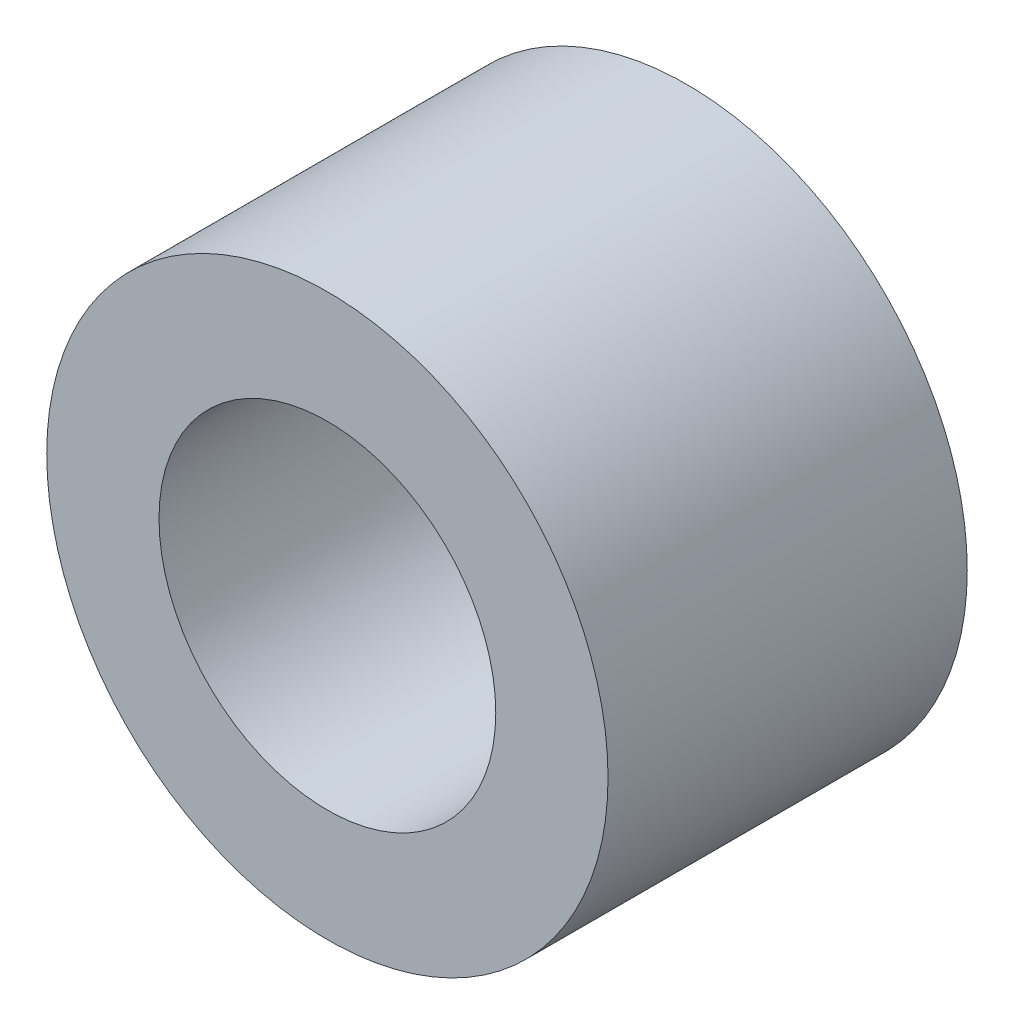
ISO-10303-21;
HEADER;
FILE_DESCRIPTION(('STEP AP214'),'2;1');
FILE_NAME('part.step','',(''),(''),'','','');
FILE_SCHEMA(('AUTOMOTIVE_DESIGN { 1 0 10303 214 1 1 1 1 }'));
ENDSEC;
DATA;
#1=APPLICATION_CONTEXT('core data for automotive mechanical design processes');
#2=APPLICATION_PROTOCOL_DEFINITION('international standard','automotive_design',2000,#1);
#3=PRODUCT_CONTEXT('',#1,'mechanical');
#4=PRODUCT('Part','Part','',(#3));
#5=PRODUCT_RELATED_PRODUCT_CATEGORY('part','',(#4));
#6=PRODUCT_DEFINITION_FORMATION('','',#4);
#7=PRODUCT_DEFINITION_CONTEXT('part definition',#1,'design');
#8=PRODUCT_DEFINITION('design','',#6,#7);
#9=PRODUCT_DEFINITION_SHAPE('','',#8);
#10=(LENGTH_UNIT() NAMED_UNIT(*) SI_UNIT(.MILLI.,.METRE.));
#11=(NAMED_UNIT(*) PLANE_ANGLE_UNIT() SI_UNIT($,.RADIAN.));
#12=(NAMED_UNIT(*) SI_UNIT($,.STERADIAN.) SOLID_ANGLE_UNIT());
#13=UNCERTAINTY_MEASURE_WITH_UNIT(LENGTH_MEASURE(1.E-05),#10,'distance_accuracy_value','');
#14=(GEOMETRIC_REPRESENTATION_CONTEXT(3) GLOBAL_UNCERTAINTY_ASSIGNED_CONTEXT((#13)) GLOBAL_UNIT_ASSIGNED_CONTEXT((#10,
#11,#12)) REPRESENTATION_CONTEXT('',''));
#15=CARTESIAN_POINT('',(0.,0.,0.));
#16=DIRECTION('',(0.,0.,1.));
#17=DIRECTION('',(1.,0.,0.));
#18=AXIS2_PLACEMENT_3D('',#15,#16,#17);
#19=CARTESIAN_POINT('',(0.,0.,3.2));
#20=DIRECTION('',(0.,0.,1.));
#21=DIRECTION('',(1.,0.,0.));
#22=AXIS2_PLACEMENT_3D('',#19,#20,#21);
#23=PLANE('',#22);
#24=CARTESIAN_POINT('',(0.,0.,3.2));
#25=DIRECTION('',(0.,0.,1.));
#26=DIRECTION('',(1.,0.,0.));
#27=AXIS2_PLACEMENT_3D('',#24,#25,#26);
#28=CIRCLE('',#27,2.5);
#29=CARTESIAN_POINT('',(2.49999999999992,0.,3.2));
#30=VERTEX_POINT('',#29);
#31=EDGE_CURVE('E10',#30,#30,#28,.T.);
#32=ORIENTED_EDGE('',*,*,#31,.T.);
#33=EDGE_LOOP('',(#32));
#34=FACE_BOUND('',#33,.T.);
#35=CARTESIAN_POINT('',(0.,0.,3.2));
#36=DIRECTION('',(0.,0.,1.));
#37=DIRECTION('',(1.,0.,0.));
#38=AXIS2_PLACEMENT_3D('',#35,#36,#37);
#39=CIRCLE('',#38,1.5);
#40=CARTESIAN_POINT('',(1.49999999999992,0.,3.2));
#41=VERTEX_POINT('',#40);
#42=EDGE_CURVE('E41',#41,#41,#39,.T.);
#43=ORIENTED_EDGE('',*,*,#42,.F.);
#44=EDGE_LOOP('',(#43));
#45=FACE_BOUND('',#44,.T.);
#46=ADVANCED_FACE('F30',(#34,#45),#23,.T.);
#47=CARTESIAN_POINT('',(0.,0.,0.));
#48=DIRECTION('',(0.,0.,1.));
#49=DIRECTION('',(1.,0.,0.));
#50=AXIS2_PLACEMENT_3D('',#47,#48,#49);
#51=PLANE('',#50);
#52=CARTESIAN_POINT('',(0.,0.,0.));
#53=DIRECTION('',(0.,0.,1.));
#54=DIRECTION('',(1.,0.,0.));
#55=AXIS2_PLACEMENT_3D('',#52,#53,#54);
#56=CIRCLE('',#55,2.5);
#57=CARTESIAN_POINT('',(2.5,0.,0.));
#58=VERTEX_POINT('',#57);
#59=EDGE_CURVE('E34',#58,#58,#56,.T.);
#60=ORIENTED_EDGE('',*,*,#59,.F.);
#61=EDGE_LOOP('',(#60));
#62=FACE_BOUND('',#61,.T.);
#63=CARTESIAN_POINT('',(0.,0.,0.));
#64=DIRECTION('',(0.,0.,1.));
#65=DIRECTION('',(1.,0.,0.));
#66=AXIS2_PLACEMENT_3D('',#63,#64,#65);
#67=CIRCLE('',#66,1.5);
#68=CARTESIAN_POINT('',(1.5,0.,0.));
#69=VERTEX_POINT('',#68);
#70=EDGE_CURVE('E43',#69,#69,#67,.T.);
#71=ORIENTED_EDGE('',*,*,#70,.T.);
#72=EDGE_LOOP('',(#71));
#73=FACE_BOUND('',#72,.T.);
#74=ADVANCED_FACE('F53',(#62,#73),#51,.F.);
#75=CARTESIAN_POINT('',(0.,0.,3.2));
#76=DIRECTION('',(0.,0.,-1.));
#77=DIRECTION('',(-1.,0.,0.));
#78=AXIS2_PLACEMENT_3D('',#75,#76,#77);
#79=CYLINDRICAL_SURFACE('',#78,2.5);
#80=ORIENTED_EDGE('',*,*,#31,.F.);
#81=EDGE_LOOP('',(#80));
#82=FACE_BOUND('',#81,.T.);
#83=ORIENTED_EDGE('',*,*,#59,.T.);
#84=EDGE_LOOP('',(#83));
#85=FACE_BOUND('',#84,.T.);
#86=ADVANCED_FACE('F32',(#82,#85),#79,.T.);
#87=CARTESIAN_POINT('',(0.,0.,3.2));
#88=DIRECTION('',(0.,0.,-1.));
#89=DIRECTION('',(-1.,0.,0.));
#90=AXIS2_PLACEMENT_3D('',#87,#88,#89);
#91=CYLINDRICAL_SURFACE('',#90,1.5);
#92=ORIENTED_EDGE('',*,*,#42,.T.);
#93=EDGE_LOOP('',(#92));
#94=FACE_BOUND('',#93,.T.);
#95=ORIENTED_EDGE('',*,*,#70,.F.);
#96=EDGE_LOOP('',(#95));
#97=FACE_BOUND('',#96,.T.);
#98=ADVANCED_FACE('F49',(#94,#97),#91,.F.);
#99=CLOSED_SHELL('',(#46,#74,#86,#98));
#100=MANIFOLD_SOLID_BREP('B2',#99);
#101=ADVANCED_BREP_SHAPE_REPRESENTATION('',(#18,#100),#14);
#102=SHAPE_DEFINITION_REPRESENTATION(#9,#101);
ENDSEC;
END-ISO-10303-21;
